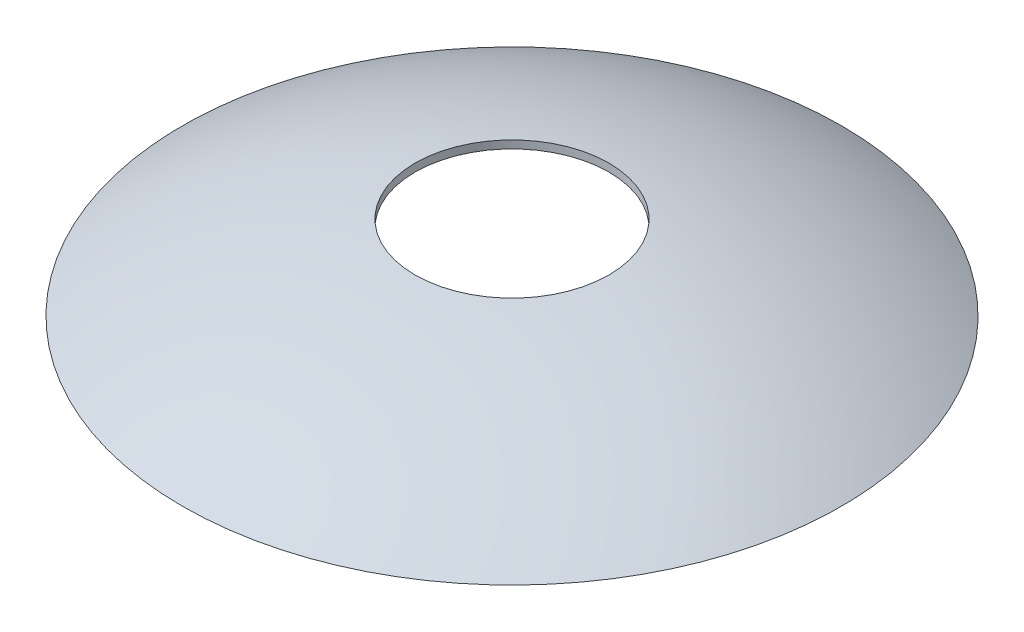
ISO-10303-21;
HEADER;
FILE_DESCRIPTION(('STEP AP214'),'2;1');
FILE_NAME('part.step','',(''),(''),'','','');
FILE_SCHEMA(('AUTOMOTIVE_DESIGN { 1 0 10303 214 1 1 1 1 }'));
ENDSEC;
DATA;
#1=APPLICATION_CONTEXT('core data for automotive mechanical design processes');
#2=APPLICATION_PROTOCOL_DEFINITION('international standard','automotive_design',2000,#1);
#3=PRODUCT_CONTEXT('',#1,'mechanical');
#4=PRODUCT('Part','Part','',(#3));
#5=PRODUCT_RELATED_PRODUCT_CATEGORY('part','',(#4));
#6=PRODUCT_DEFINITION_FORMATION('','',#4);
#7=PRODUCT_DEFINITION_CONTEXT('part definition',#1,'design');
#8=PRODUCT_DEFINITION('design','',#6,#7);
#9=PRODUCT_DEFINITION_SHAPE('','',#8);
#10=(LENGTH_UNIT() NAMED_UNIT(*) SI_UNIT(.MILLI.,.METRE.));
#11=(NAMED_UNIT(*) PLANE_ANGLE_UNIT() SI_UNIT($,.RADIAN.));
#12=(NAMED_UNIT(*) SI_UNIT($,.STERADIAN.) SOLID_ANGLE_UNIT());
#13=UNCERTAINTY_MEASURE_WITH_UNIT(LENGTH_MEASURE(1.E-05),#10,'distance_accuracy_value','');
#14=(GEOMETRIC_REPRESENTATION_CONTEXT(3) GLOBAL_UNCERTAINTY_ASSIGNED_CONTEXT((#13)) GLOBAL_UNIT_ASSIGNED_CONTEXT((#10,
#11,#12)) REPRESENTATION_CONTEXT('',''));
#15=CARTESIAN_POINT('',(0.,0.,0.));
#16=DIRECTION('',(0.,0.,1.));
#17=DIRECTION('',(1.,0.,0.));
#18=AXIS2_PLACEMENT_3D('',#15,#16,#17);
#19=CARTESIAN_POINT('',(0.,-123.072331135289,0.));
#20=DIRECTION('',(0.,1.,0.));
#21=DIRECTION('',(0.,0.,1.));
#22=AXIS2_PLACEMENT_3D('',#19,#20,#21);
#23=DEGENERATE_TOROIDAL_SURFACE('',#22,6.65848947503409,145.891024269513,.T.);
#24=CARTESIAN_POINT('',(0.,0.,0.));
#25=DIRECTION('',(0.,1.,0.));
#26=DIRECTION('',(0.,0.,1.));
#27=AXIS2_PLACEMENT_3D('',#24,#25,#26);
#28=CIRCLE('',#27,85.);
#29=CARTESIAN_POINT('',(0.,0.,85.));
#30=VERTEX_POINT('',#29);
#31=EDGE_CURVE('E10',#30,#30,#28,.T.);
#32=ORIENTED_EDGE('',*,*,#31,.T.);
#33=EDGE_LOOP('',(#32));
#34=FACE_BOUND('',#33,.T.);
#35=CARTESIAN_POINT('',(0.,21.6611479014223,0.));
#36=DIRECTION('',(0.,-1.,0.));
#37=DIRECTION('',(0.,0.,-1.));
#38=AXIS2_PLACEMENT_3D('',#35,#36,#37);
#39=CIRCLE('',#38,25.);
#40=CARTESIAN_POINT('',(0.,21.6611479014223,-25.));
#41=VERTEX_POINT('',#40);
#42=EDGE_CURVE('E58',#41,#41,#39,.F.);
#43=ORIENTED_EDGE('',*,*,#42,.F.);
#44=EDGE_LOOP('',(#43));
#45=FACE_BOUND('',#44,.T.);
#46=ADVANCED_FACE('F45',(#34,#45),#23,.T.);
#47=CARTESIAN_POINT('',(0.,-123.072331135289,0.));
#48=DIRECTION('',(0.,1.,0.));
#49=DIRECTION('',(0.,0.,1.));
#50=AXIS2_PLACEMENT_3D('',#47,#48,#49);
#51=DEGENERATE_TOROIDAL_SURFACE('',#50,6.65848947503409,143.891024269513,.T.);
#52=CARTESIAN_POINT('',(0.,0.,0.));
#53=DIRECTION('',(0.,1.,0.));
#54=DIRECTION('',(0.,0.,1.));
#55=AXIS2_PLACEMENT_3D('',#52,#53,#54);
#56=CIRCLE('',#55,81.2093323559519);
#57=CARTESIAN_POINT('',(0.,0.,81.2093323559519));
#58=VERTEX_POINT('',#57);
#59=EDGE_CURVE('E53',#58,#58,#56,.T.);
#60=ORIENTED_EDGE('',*,*,#59,.F.);
#61=EDGE_LOOP('',(#60));
#62=FACE_BOUND('',#61,.T.);
#63=CARTESIAN_POINT('',(0.,19.6449273059804,0.));
#64=DIRECTION('',(0.,-1.,0.));
#65=DIRECTION('',(0.,0.,-1.));
#66=AXIS2_PLACEMENT_3D('',#63,#64,#65);
#67=CIRCLE('',#66,25.);
#68=CARTESIAN_POINT('',(0.,19.6449273059804,-25.));
#69=VERTEX_POINT('',#68);
#70=EDGE_CURVE('E48',#69,#69,#67,.F.);
#71=ORIENTED_EDGE('',*,*,#70,.T.);
#72=EDGE_LOOP('',(#71));
#73=FACE_BOUND('',#72,.T.);
#74=ADVANCED_FACE('F69',(#62,#73),#51,.F.);
#75=CARTESIAN_POINT('',(0.,0.,0.));
#76=DIRECTION('',(0.,1.,0.));
#77=DIRECTION('',(0.,0.,1.));
#78=AXIS2_PLACEMENT_3D('',#75,#76,#77);
#79=PLANE('',#78);
#80=ORIENTED_EDGE('',*,*,#59,.T.);
#81=EDGE_LOOP('',(#80));
#82=FACE_BOUND('',#81,.T.);
#83=ORIENTED_EDGE('',*,*,#31,.F.);
#84=EDGE_LOOP('',(#83));
#85=FACE_BOUND('',#84,.T.);
#86=ADVANCED_FACE('F73',(#82,#85),#79,.F.);
#87=CARTESIAN_POINT('',(0.,37.5749581907398,0.));
#88=DIRECTION('',(0.,-1.,0.));
#89=DIRECTION('',(0.,0.,-1.));
#90=AXIS2_PLACEMENT_3D('',#87,#88,#89);
#91=CYLINDRICAL_SURFACE('',#90,25.);
#92=ORIENTED_EDGE('',*,*,#70,.F.);
#93=EDGE_LOOP('',(#92));
#94=FACE_BOUND('',#93,.T.);
#95=ORIENTED_EDGE('',*,*,#42,.T.);
#96=EDGE_LOOP('',(#95));
#97=FACE_BOUND('',#96,.T.);
#98=ADVANCED_FACE('F71',(#94,#97),#91,.F.);
#99=CLOSED_SHELL('',(#46,#74,#86,#98));
#100=MANIFOLD_SOLID_BREP('B2',#99);
#101=ADVANCED_BREP_SHAPE_REPRESENTATION('',(#18,#100),#14);
#102=SHAPE_DEFINITION_REPRESENTATION(#9,#101);
ENDSEC;
END-ISO-10303-21;
